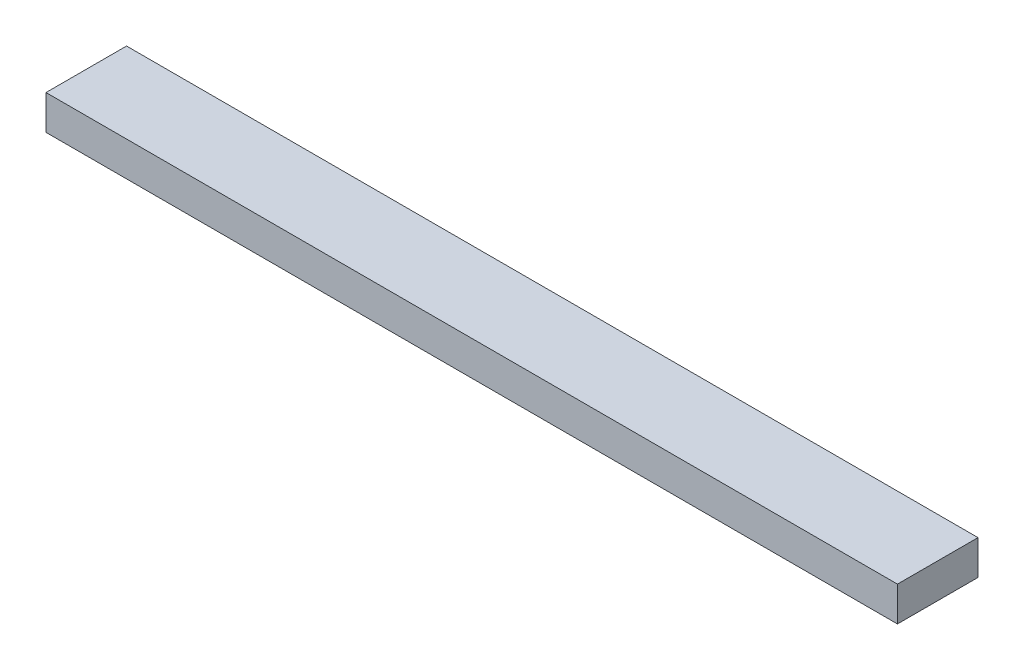
ISO-10303-21;
HEADER;
FILE_DESCRIPTION(('STEP AP214'),'2;1');
FILE_NAME('part.step','',(''),(''),'','','');
FILE_SCHEMA(('AUTOMOTIVE_DESIGN { 1 0 10303 214 1 1 1 1 }'));
ENDSEC;
DATA;
#1=APPLICATION_CONTEXT('core data for automotive mechanical design processes');
#2=APPLICATION_PROTOCOL_DEFINITION('international standard','automotive_design',2000,#1);
#3=PRODUCT_CONTEXT('',#1,'mechanical');
#4=PRODUCT('Part','Part','',(#3));
#5=PRODUCT_RELATED_PRODUCT_CATEGORY('part','',(#4));
#6=PRODUCT_DEFINITION_FORMATION('','',#4);
#7=PRODUCT_DEFINITION_CONTEXT('part definition',#1,'design');
#8=PRODUCT_DEFINITION('design','',#6,#7);
#9=PRODUCT_DEFINITION_SHAPE('','',#8);
#10=(LENGTH_UNIT() NAMED_UNIT(*) SI_UNIT(.MILLI.,.METRE.));
#11=(NAMED_UNIT(*) PLANE_ANGLE_UNIT() SI_UNIT($,.RADIAN.));
#12=(NAMED_UNIT(*) SI_UNIT($,.STERADIAN.) SOLID_ANGLE_UNIT());
#13=UNCERTAINTY_MEASURE_WITH_UNIT(LENGTH_MEASURE(1.E-05),#10,'distance_accuracy_value','');
#14=(GEOMETRIC_REPRESENTATION_CONTEXT(3) GLOBAL_UNCERTAINTY_ASSIGNED_CONTEXT((#13)) GLOBAL_UNIT_ASSIGNED_CONTEXT((#10,
#11,#12)) REPRESENTATION_CONTEXT('',''));
#15=CARTESIAN_POINT('',(0.,0.,0.));
#16=DIRECTION('',(0.,0.,1.));
#17=DIRECTION('',(1.,0.,0.));
#18=AXIS2_PLACEMENT_3D('',#15,#16,#17);
#19=CARTESIAN_POINT('',(469.8492,-19.05,88.9));
#20=DIRECTION('',(-1.,0.,0.));
#21=DIRECTION('',(0.,0.,1.));
#22=AXIS2_PLACEMENT_3D('',#19,#20,#21);
#23=PLANE('',#22);
#24=DIRECTION('',(0.,1.,0.));
#25=VECTOR('',#24,1.);
#26=CARTESIAN_POINT('',(469.8492,-19.05,0.));
#27=LINE('',#26,#25);
#28=CARTESIAN_POINT('',(469.8492,-19.05,0.));
#29=VERTEX_POINT('',#28);
#30=CARTESIAN_POINT('',(469.8492,19.05,0.));
#31=VERTEX_POINT('',#30);
#32=EDGE_CURVE('E98',#29,#31,#27,.T.);
#33=ORIENTED_EDGE('',*,*,#32,.T.);
#34=DIRECTION('',(0.,0.,-1.));
#35=VECTOR('',#34,1.);
#36=CARTESIAN_POINT('',(469.8492,19.05,88.9));
#37=LINE('',#36,#35);
#38=CARTESIAN_POINT('',(469.8492,19.05,88.9));
#39=VERTEX_POINT('',#38);
#40=EDGE_CURVE('E11',#39,#31,#37,.T.);
#41=ORIENTED_EDGE('',*,*,#40,.F.);
#42=DIRECTION('',(0.,1.,0.));
#43=VECTOR('',#42,1.);
#44=CARTESIAN_POINT('',(469.8492,-19.05,88.9));
#45=LINE('',#44,#43);
#46=CARTESIAN_POINT('',(469.8492,-19.05,88.9));
#47=VERTEX_POINT('',#46);
#48=EDGE_CURVE('E86',#47,#39,#45,.T.);
#49=ORIENTED_EDGE('',*,*,#48,.F.);
#50=DIRECTION('',(0.,0.,-1.));
#51=VECTOR('',#50,1.);
#52=CARTESIAN_POINT('',(469.8492,-19.05,88.9));
#53=LINE('',#52,#51);
#54=EDGE_CURVE('E94',#47,#29,#53,.T.);
#55=ORIENTED_EDGE('',*,*,#54,.T.);
#56=EDGE_LOOP('',(#33,#41,#49,#55));
#57=FACE_BOUND('',#56,.T.);
#58=ADVANCED_FACE('F35',(#57),#23,.F.);
#59=CARTESIAN_POINT('',(-469.8492,19.05,88.9));
#60=DIRECTION('',(0.,-1.,0.));
#61=DIRECTION('',(0.,0.,-1.));
#62=AXIS2_PLACEMENT_3D('',#59,#60,#61);
#63=PLANE('',#62);
#64=DIRECTION('',(-1.,0.,0.));
#65=VECTOR('',#64,1.);
#66=CARTESIAN_POINT('',(-469.8492,19.05,0.));
#67=LINE('',#66,#65);
#68=CARTESIAN_POINT('',(-469.8492,19.05,0.));
#69=VERTEX_POINT('',#68);
#70=EDGE_CURVE('E90',#31,#69,#67,.T.);
#71=ORIENTED_EDGE('',*,*,#70,.T.);
#72=DIRECTION('',(0.,0.,-1.));
#73=VECTOR('',#72,1.);
#74=CARTESIAN_POINT('',(-469.8492,19.05,88.9));
#75=LINE('',#74,#73);
#76=CARTESIAN_POINT('',(-469.8492,19.05,88.9));
#77=VERTEX_POINT('',#76);
#78=EDGE_CURVE('E43',#77,#69,#75,.T.);
#79=ORIENTED_EDGE('',*,*,#78,.F.);
#80=DIRECTION('',(-1.,0.,0.));
#81=VECTOR('',#80,1.);
#82=CARTESIAN_POINT('',(-469.8492,19.05,88.9));
#83=LINE('',#82,#81);
#84=EDGE_CURVE('E81',#39,#77,#83,.T.);
#85=ORIENTED_EDGE('',*,*,#84,.F.);
#86=ORIENTED_EDGE('',*,*,#40,.T.);
#87=EDGE_LOOP('',(#71,#79,#85,#86));
#88=FACE_BOUND('',#87,.T.);
#89=ADVANCED_FACE('F89',(#88),#63,.F.);
#90=CARTESIAN_POINT('',(-469.8492,-19.05,88.9));
#91=DIRECTION('',(1.,0.,0.));
#92=DIRECTION('',(0.,0.,-1.));
#93=AXIS2_PLACEMENT_3D('',#90,#91,#92);
#94=PLANE('',#93);
#95=DIRECTION('',(0.,-1.,0.));
#96=VECTOR('',#95,1.);
#97=CARTESIAN_POINT('',(-469.8492,-19.05,0.));
#98=LINE('',#97,#96);
#99=CARTESIAN_POINT('',(-469.8492,-19.05,0.));
#100=VERTEX_POINT('',#99);
#101=EDGE_CURVE('E68',#69,#100,#98,.T.);
#102=ORIENTED_EDGE('',*,*,#101,.T.);
#103=DIRECTION('',(0.,0.,-1.));
#104=VECTOR('',#103,1.);
#105=CARTESIAN_POINT('',(-469.8492,-19.05,88.9));
#106=LINE('',#105,#104);
#107=CARTESIAN_POINT('',(-469.8492,-19.05,88.9));
#108=VERTEX_POINT('',#107);
#109=EDGE_CURVE('E91',#108,#100,#106,.T.);
#110=ORIENTED_EDGE('',*,*,#109,.F.);
#111=DIRECTION('',(0.,-1.,0.));
#112=VECTOR('',#111,1.);
#113=CARTESIAN_POINT('',(-469.8492,-19.05,88.9));
#114=LINE('',#113,#112);
#115=EDGE_CURVE('E84',#77,#108,#114,.T.);
#116=ORIENTED_EDGE('',*,*,#115,.F.);
#117=ORIENTED_EDGE('',*,*,#78,.T.);
#118=EDGE_LOOP('',(#102,#110,#116,#117));
#119=FACE_BOUND('',#118,.T.);
#120=ADVANCED_FACE('F92',(#119),#94,.F.);
#121=CARTESIAN_POINT('',(-469.8492,-19.05,88.9));
#122=DIRECTION('',(0.,1.,0.));
#123=DIRECTION('',(0.,0.,1.));
#124=AXIS2_PLACEMENT_3D('',#121,#122,#123);
#125=PLANE('',#124);
#126=DIRECTION('',(1.,0.,0.));
#127=VECTOR('',#126,1.);
#128=CARTESIAN_POINT('',(-469.8492,-19.05,0.));
#129=LINE('',#128,#127);
#130=EDGE_CURVE('E74',#100,#29,#129,.T.);
#131=ORIENTED_EDGE('',*,*,#130,.T.);
#132=ORIENTED_EDGE('',*,*,#54,.F.);
#133=DIRECTION('',(1.,0.,0.));
#134=VECTOR('',#133,1.);
#135=CARTESIAN_POINT('',(-469.8492,-19.05,88.9));
#136=LINE('',#135,#134);
#137=EDGE_CURVE('E51',#108,#47,#136,.T.);
#138=ORIENTED_EDGE('',*,*,#137,.F.);
#139=ORIENTED_EDGE('',*,*,#109,.T.);
#140=EDGE_LOOP('',(#131,#132,#138,#139));
#141=FACE_BOUND('',#140,.T.);
#142=ADVANCED_FACE('F105',(#141),#125,.F.);
#143=CARTESIAN_POINT('',(0.,0.,88.9));
#144=DIRECTION('',(0.,0.,-1.));
#145=DIRECTION('',(-1.,0.,0.));
#146=AXIS2_PLACEMENT_3D('',#143,#144,#145);
#147=PLANE('',#146);
#148=ORIENTED_EDGE('',*,*,#48,.T.);
#149=ORIENTED_EDGE('',*,*,#84,.T.);
#150=ORIENTED_EDGE('',*,*,#115,.T.);
#151=ORIENTED_EDGE('',*,*,#137,.T.);
#152=EDGE_LOOP('',(#148,#149,#150,#151));
#153=FACE_BOUND('',#152,.T.);
#154=ADVANCED_FACE('F82',(#153),#147,.F.);
#155=CARTESIAN_POINT('',(0.,0.,0.));
#156=DIRECTION('',(0.,0.,-1.));
#157=DIRECTION('',(-1.,0.,0.));
#158=AXIS2_PLACEMENT_3D('',#155,#156,#157);
#159=PLANE('',#158);
#160=ORIENTED_EDGE('',*,*,#32,.F.);
#161=ORIENTED_EDGE('',*,*,#130,.F.);
#162=ORIENTED_EDGE('',*,*,#101,.F.);
#163=ORIENTED_EDGE('',*,*,#70,.F.);
#164=EDGE_LOOP('',(#160,#161,#162,#163));
#165=FACE_BOUND('',#164,.T.);
#166=ADVANCED_FACE('F108',(#165),#159,.T.);
#167=CLOSED_SHELL('',(#58,#89,#120,#142,#154,#166));
#168=MANIFOLD_SOLID_BREP('B2',#167);
#169=ADVANCED_BREP_SHAPE_REPRESENTATION('',(#18,#168),#14);
#170=SHAPE_DEFINITION_REPRESENTATION(#9,#169);
ENDSEC;
END-ISO-10303-21;
